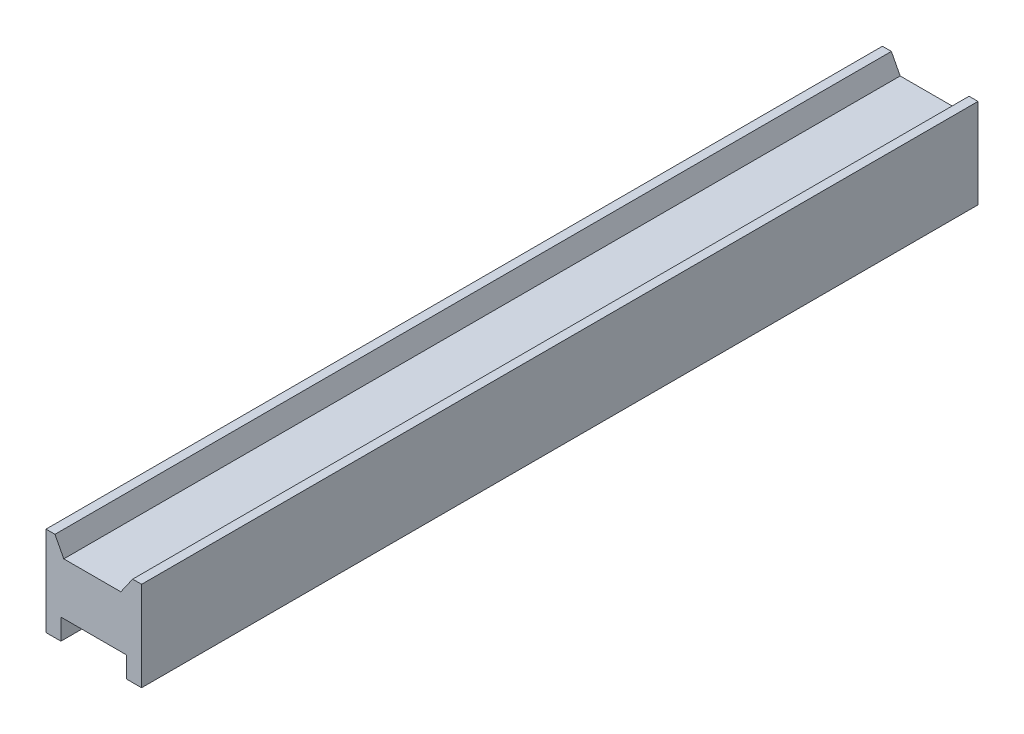
ISO-10303-21;
HEADER;
FILE_DESCRIPTION(('STEP AP214'),'2;1');
FILE_NAME('part.step','',(''),(''),'','','');
FILE_SCHEMA(('AUTOMOTIVE_DESIGN { 1 0 10303 214 1 1 1 1 }'));
ENDSEC;
DATA;
#1=APPLICATION_CONTEXT('core data for automotive mechanical design processes');
#2=APPLICATION_PROTOCOL_DEFINITION('international standard','automotive_design',2000,#1);
#3=PRODUCT_CONTEXT('',#1,'mechanical');
#4=PRODUCT('Part','Part','',(#3));
#5=PRODUCT_RELATED_PRODUCT_CATEGORY('part','',(#4));
#6=PRODUCT_DEFINITION_FORMATION('','',#4);
#7=PRODUCT_DEFINITION_CONTEXT('part definition',#1,'design');
#8=PRODUCT_DEFINITION('design','',#6,#7);
#9=PRODUCT_DEFINITION_SHAPE('','',#8);
#10=(LENGTH_UNIT() NAMED_UNIT(*) SI_UNIT(.MILLI.,.METRE.));
#11=(NAMED_UNIT(*) PLANE_ANGLE_UNIT() SI_UNIT($,.RADIAN.));
#12=(NAMED_UNIT(*) SI_UNIT($,.STERADIAN.) SOLID_ANGLE_UNIT());
#13=UNCERTAINTY_MEASURE_WITH_UNIT(LENGTH_MEASURE(1.E-05),#10,'distance_accuracy_value','');
#14=(GEOMETRIC_REPRESENTATION_CONTEXT(3) GLOBAL_UNCERTAINTY_ASSIGNED_CONTEXT((#13)) GLOBAL_UNIT_ASSIGNED_CONTEXT((#10,
#11,#12)) REPRESENTATION_CONTEXT('',''));
#15=CARTESIAN_POINT('',(0.,0.,0.));
#16=DIRECTION('',(0.,0.,1.));
#17=DIRECTION('',(1.,0.,0.));
#18=AXIS2_PLACEMENT_3D('',#15,#16,#17);
#19=CARTESIAN_POINT('',(0.,0.,14000.));
#20=DIRECTION('',(0.,1.,0.));
#21=DIRECTION('',(0.,0.,1.));
#22=AXIS2_PLACEMENT_3D('',#19,#20,#21);
#23=PLANE('',#22);
#24=DIRECTION('',(1.,0.,0.));
#25=VECTOR('',#24,1.);
#26=CARTESIAN_POINT('',(0.,0.,0.));
#27=LINE('',#26,#25);
#28=CARTESIAN_POINT('',(0.,0.,0.));
#29=VERTEX_POINT('',#28);
#30=CARTESIAN_POINT('',(250.,0.,0.));
#31=VERTEX_POINT('',#30);
#32=EDGE_CURVE('E155',#29,#31,#27,.T.);
#33=ORIENTED_EDGE('',*,*,#32,.T.);
#34=DIRECTION('',(0.,0.,-1.));
#35=VECTOR('',#34,1.);
#36=CARTESIAN_POINT('',(250.,0.,14000.));
#37=LINE('',#36,#35);
#38=CARTESIAN_POINT('',(250.,0.,14000.));
#39=VERTEX_POINT('',#38);
#40=EDGE_CURVE('E11',#39,#31,#37,.T.);
#41=ORIENTED_EDGE('',*,*,#40,.F.);
#42=DIRECTION('',(1.,0.,0.));
#43=VECTOR('',#42,1.);
#44=CARTESIAN_POINT('',(0.,0.,14000.));
#45=LINE('',#44,#43);
#46=CARTESIAN_POINT('',(0.,0.,14000.));
#47=VERTEX_POINT('',#46);
#48=EDGE_CURVE('E177',#47,#39,#45,.T.);
#49=ORIENTED_EDGE('',*,*,#48,.F.);
#50=DIRECTION('',(0.,0.,-1.));
#51=VECTOR('',#50,1.);
#52=CARTESIAN_POINT('',(0.,0.,14000.));
#53=LINE('',#52,#51);
#54=EDGE_CURVE('E151',#47,#29,#53,.T.);
#55=ORIENTED_EDGE('',*,*,#54,.T.);
#56=EDGE_LOOP('',(#33,#41,#49,#55));
#57=FACE_BOUND('',#56,.T.);
#58=ADVANCED_FACE('F35',(#57),#23,.F.);
#59=CARTESIAN_POINT('',(250.,0.,14000.));
#60=DIRECTION('',(-1.,0.,0.));
#61=DIRECTION('',(0.,0.,1.));
#62=AXIS2_PLACEMENT_3D('',#59,#60,#61);
#63=PLANE('',#62);
#64=DIRECTION('',(0.,1.,0.));
#65=VECTOR('',#64,1.);
#66=CARTESIAN_POINT('',(250.,0.,0.));
#67=LINE('',#66,#65);
#68=CARTESIAN_POINT('',(250.,350.,0.));
#69=VERTEX_POINT('',#68);
#70=EDGE_CURVE('E158',#31,#69,#67,.T.);
#71=ORIENTED_EDGE('',*,*,#70,.T.);
#72=DIRECTION('',(0.,0.,-1.));
#73=VECTOR('',#72,1.);
#74=CARTESIAN_POINT('',(250.,350.,14000.));
#75=LINE('',#74,#73);
#76=CARTESIAN_POINT('',(250.,350.,14000.));
#77=VERTEX_POINT('',#76);
#78=EDGE_CURVE('E43',#77,#69,#75,.T.);
#79=ORIENTED_EDGE('',*,*,#78,.F.);
#80=DIRECTION('',(0.,1.,0.));
#81=VECTOR('',#80,1.);
#82=CARTESIAN_POINT('',(250.,0.,14000.));
#83=LINE('',#82,#81);
#84=EDGE_CURVE('E106',#39,#77,#83,.T.);
#85=ORIENTED_EDGE('',*,*,#84,.F.);
#86=ORIENTED_EDGE('',*,*,#40,.T.);
#87=EDGE_LOOP('',(#71,#79,#85,#86));
#88=FACE_BOUND('',#87,.T.);
#89=ADVANCED_FACE('F255',(#88),#63,.F.);
#90=CARTESIAN_POINT('',(250.,350.,14000.));
#91=DIRECTION('',(0.,1.,0.));
#92=DIRECTION('',(0.,0.,1.));
#93=AXIS2_PLACEMENT_3D('',#90,#91,#92);
#94=PLANE('',#93);
#95=DIRECTION('',(1.,0.,0.));
#96=VECTOR('',#95,1.);
#97=CARTESIAN_POINT('',(250.,350.,0.));
#98=LINE('',#97,#96);
#99=CARTESIAN_POINT('',(1350.,350.,0.));
#100=VERTEX_POINT('',#99);
#101=EDGE_CURVE('E160',#69,#100,#98,.T.);
#102=ORIENTED_EDGE('',*,*,#101,.T.);
#103=DIRECTION('',(0.,0.,-1.));
#104=VECTOR('',#103,1.);
#105=CARTESIAN_POINT('',(1350.,350.,14000.));
#106=LINE('',#105,#104);
#107=CARTESIAN_POINT('',(1350.,350.,14000.));
#108=VERTEX_POINT('',#107);
#109=EDGE_CURVE('E196',#108,#100,#106,.T.);
#110=ORIENTED_EDGE('',*,*,#109,.F.);
#111=DIRECTION('',(1.,0.,0.));
#112=VECTOR('',#111,1.);
#113=CARTESIAN_POINT('',(250.,350.,14000.));
#114=LINE('',#113,#112);
#115=EDGE_CURVE('E204',#77,#108,#114,.T.);
#116=ORIENTED_EDGE('',*,*,#115,.F.);
#117=ORIENTED_EDGE('',*,*,#78,.T.);
#118=EDGE_LOOP('',(#102,#110,#116,#117));
#119=FACE_BOUND('',#118,.T.);
#120=ADVANCED_FACE('F202',(#119),#94,.F.);
#121=CARTESIAN_POINT('',(1350.,350.,14000.));
#122=DIRECTION('',(1.,0.,0.));
#123=DIRECTION('',(0.,0.,-1.));
#124=AXIS2_PLACEMENT_3D('',#121,#122,#123);
#125=PLANE('',#124);
#126=DIRECTION('',(0.,-1.,0.));
#127=VECTOR('',#126,1.);
#128=CARTESIAN_POINT('',(1350.,350.,0.));
#129=LINE('',#128,#127);
#130=CARTESIAN_POINT('',(1350.,0.,0.));
#131=VERTEX_POINT('',#130);
#132=EDGE_CURVE('E162',#100,#131,#129,.T.);
#133=ORIENTED_EDGE('',*,*,#132,.T.);
#134=DIRECTION('',(0.,0.,-1.));
#135=VECTOR('',#134,1.);
#136=CARTESIAN_POINT('',(1350.,0.,14000.));
#137=LINE('',#136,#135);
#138=CARTESIAN_POINT('',(1350.,0.,14000.));
#139=VERTEX_POINT('',#138);
#140=EDGE_CURVE('E193',#139,#131,#137,.T.);
#141=ORIENTED_EDGE('',*,*,#140,.F.);
#142=DIRECTION('',(0.,-1.,0.));
#143=VECTOR('',#142,1.);
#144=CARTESIAN_POINT('',(1350.,350.,14000.));
#145=LINE('',#144,#143);
#146=EDGE_CURVE('E222',#108,#139,#145,.T.);
#147=ORIENTED_EDGE('',*,*,#146,.F.);
#148=ORIENTED_EDGE('',*,*,#109,.T.);
#149=EDGE_LOOP('',(#133,#141,#147,#148));
#150=FACE_BOUND('',#149,.T.);
#151=ADVANCED_FACE('F213',(#150),#125,.F.);
#152=CARTESIAN_POINT('',(1350.,0.,14000.));
#153=DIRECTION('',(0.,1.,0.));
#154=DIRECTION('',(0.,0.,1.));
#155=AXIS2_PLACEMENT_3D('',#152,#153,#154);
#156=PLANE('',#155);
#157=DIRECTION('',(1.,0.,0.));
#158=VECTOR('',#157,1.);
#159=CARTESIAN_POINT('',(1350.,0.,0.));
#160=LINE('',#159,#158);
#161=CARTESIAN_POINT('',(1600.,0.,0.));
#162=VERTEX_POINT('',#161);
#163=EDGE_CURVE('E164',#131,#162,#160,.T.);
#164=ORIENTED_EDGE('',*,*,#163,.T.);
#165=DIRECTION('',(0.,0.,-1.));
#166=VECTOR('',#165,1.);
#167=CARTESIAN_POINT('',(1600.,0.,14000.));
#168=LINE('',#167,#166);
#169=CARTESIAN_POINT('',(1600.,0.,14000.));
#170=VERTEX_POINT('',#169);
#171=EDGE_CURVE('E190',#170,#162,#168,.T.);
#172=ORIENTED_EDGE('',*,*,#171,.F.);
#173=DIRECTION('',(1.,0.,0.));
#174=VECTOR('',#173,1.);
#175=CARTESIAN_POINT('',(1350.,0.,14000.));
#176=LINE('',#175,#174);
#177=EDGE_CURVE('E219',#139,#170,#176,.T.);
#178=ORIENTED_EDGE('',*,*,#177,.F.);
#179=ORIENTED_EDGE('',*,*,#140,.T.);
#180=EDGE_LOOP('',(#164,#172,#178,#179));
#181=FACE_BOUND('',#180,.T.);
#182=ADVANCED_FACE('F217',(#181),#156,.F.);
#183=CARTESIAN_POINT('',(1600.,0.,14000.));
#184=DIRECTION('',(-1.,0.,0.));
#185=DIRECTION('',(0.,0.,1.));
#186=AXIS2_PLACEMENT_3D('',#183,#184,#185);
#187=PLANE('',#186);
#188=DIRECTION('',(0.,1.,0.));
#189=VECTOR('',#188,1.);
#190=CARTESIAN_POINT('',(1600.,0.,0.));
#191=LINE('',#190,#189);
#192=CARTESIAN_POINT('',(1600.,1500.,0.));
#193=VERTEX_POINT('',#192);
#194=EDGE_CURVE('E166',#162,#193,#191,.T.);
#195=ORIENTED_EDGE('',*,*,#194,.T.);
#196=DIRECTION('',(0.,0.,-1.));
#197=VECTOR('',#196,1.);
#198=CARTESIAN_POINT('',(1600.,1500.,14000.));
#199=LINE('',#198,#197);
#200=CARTESIAN_POINT('',(1600.,1500.,14000.));
#201=VERTEX_POINT('',#200);
#202=EDGE_CURVE('E187',#201,#193,#199,.T.);
#203=ORIENTED_EDGE('',*,*,#202,.F.);
#204=DIRECTION('',(0.,1.,0.));
#205=VECTOR('',#204,1.);
#206=CARTESIAN_POINT('',(1600.,0.,14000.));
#207=LINE('',#206,#205);
#208=EDGE_CURVE('E221',#170,#201,#207,.T.);
#209=ORIENTED_EDGE('',*,*,#208,.F.);
#210=ORIENTED_EDGE('',*,*,#171,.T.);
#211=EDGE_LOOP('',(#195,#203,#209,#210));
#212=FACE_BOUND('',#211,.T.);
#213=ADVANCED_FACE('F268',(#212),#187,.F.);
#214=CARTESIAN_POINT('',(1600.,1500.,14000.));
#215=DIRECTION('',(0.,-1.,0.));
#216=DIRECTION('',(0.,0.,-1.));
#217=AXIS2_PLACEMENT_3D('',#214,#215,#216);
#218=PLANE('',#217);
#219=DIRECTION('',(-1.,0.,0.));
#220=VECTOR('',#219,1.);
#221=CARTESIAN_POINT('',(1600.,1500.,0.));
#222=LINE('',#221,#220);
#223=CARTESIAN_POINT('',(1450.,1500.,0.));
#224=VERTEX_POINT('',#223);
#225=EDGE_CURVE('E168',#193,#224,#222,.T.);
#226=ORIENTED_EDGE('',*,*,#225,.T.);
#227=DIRECTION('',(0.,0.,-1.));
#228=VECTOR('',#227,1.);
#229=CARTESIAN_POINT('',(1450.,1500.,14000.));
#230=LINE('',#229,#228);
#231=CARTESIAN_POINT('',(1450.,1500.,14000.));
#232=VERTEX_POINT('',#231);
#233=EDGE_CURVE('E184',#232,#224,#230,.T.);
#234=ORIENTED_EDGE('',*,*,#233,.F.);
#235=DIRECTION('',(-1.,0.,0.));
#236=VECTOR('',#235,1.);
#237=CARTESIAN_POINT('',(1600.,1500.,14000.));
#238=LINE('',#237,#236);
#239=EDGE_CURVE('E224',#201,#232,#238,.T.);
#240=ORIENTED_EDGE('',*,*,#239,.F.);
#241=ORIENTED_EDGE('',*,*,#202,.T.);
#242=EDGE_LOOP('',(#226,#234,#240,#241));
#243=FACE_BOUND('',#242,.T.);
#244=ADVANCED_FACE('F271',(#243),#218,.F.);
#245=CARTESIAN_POINT('',(1450.,1500.,14000.));
#246=DIRECTION('',(0.819152044288993,-0.573576436351045,0.));
#247=DIRECTION('',(0.573576436351045,0.819152044288993,0.));
#248=AXIS2_PLACEMENT_3D('',#245,#246,#247);
#249=PLANE('',#248);
#250=DIRECTION('',(-0.573576436351045,-0.819152044288993,0.));
#251=VECTOR('',#250,1.);
#252=CARTESIAN_POINT('',(1450.,1500.,0.));
#253=LINE('',#252,#251);
#254=CARTESIAN_POINT('',(1252.23084732619,1217.55637881382,0.));
#255=VERTEX_POINT('',#254);
#256=EDGE_CURVE('E170',#224,#255,#253,.T.);
#257=ORIENTED_EDGE('',*,*,#256,.T.);
#258=DIRECTION('',(0.,0.,-1.));
#259=VECTOR('',#258,1.);
#260=CARTESIAN_POINT('',(1252.23084732619,1217.55637881382,14000.));
#261=LINE('',#260,#259);
#262=CARTESIAN_POINT('',(1252.23084732619,1217.55637881382,14000.));
#263=VERTEX_POINT('',#262);
#264=EDGE_CURVE('E181',#263,#255,#261,.T.);
#265=ORIENTED_EDGE('',*,*,#264,.F.);
#266=DIRECTION('',(-0.573576436351045,-0.819152044288993,0.));
#267=VECTOR('',#266,1.);
#268=CARTESIAN_POINT('',(1450.,1500.,14000.));
#269=LINE('',#268,#267);
#270=EDGE_CURVE('E230',#232,#263,#269,.T.);
#271=ORIENTED_EDGE('',*,*,#270,.F.);
#272=ORIENTED_EDGE('',*,*,#233,.T.);
#273=EDGE_LOOP('',(#257,#265,#271,#272));
#274=FACE_BOUND('',#273,.T.);
#275=ADVANCED_FACE('F236',(#274),#249,.F.);
#276=CARTESIAN_POINT('',(1252.23084732619,1217.55637881382,14000.));
#277=DIRECTION('',(0.,-1.,0.));
#278=DIRECTION('',(0.,0.,-1.));
#279=AXIS2_PLACEMENT_3D('',#276,#277,#278);
#280=PLANE('',#279);
#281=DIRECTION('',(-1.,0.,0.));
#282=VECTOR('',#281,1.);
#283=CARTESIAN_POINT('',(1252.23084732619,1217.55637881382,0.));
#284=LINE('',#283,#282);
#285=CARTESIAN_POINT('',(297.692749099082,1217.55637881382,0.));
#286=VERTEX_POINT('',#285);
#287=EDGE_CURVE('E172',#255,#286,#284,.T.);
#288=ORIENTED_EDGE('',*,*,#287,.T.);
#289=DIRECTION('',(0.,0.,-1.));
#290=VECTOR('',#289,1.);
#291=CARTESIAN_POINT('',(297.692749099082,1217.55637881382,14000.));
#292=LINE('',#291,#290);
#293=CARTESIAN_POINT('',(297.692749099082,1217.55637881382,14000.));
#294=VERTEX_POINT('',#293);
#295=EDGE_CURVE('E146',#294,#286,#292,.T.);
#296=ORIENTED_EDGE('',*,*,#295,.F.);
#297=DIRECTION('',(-1.,0.,0.));
#298=VECTOR('',#297,1.);
#299=CARTESIAN_POINT('',(1252.23084732619,1217.55637881382,14000.));
#300=LINE('',#299,#298);
#301=EDGE_CURVE('E137',#263,#294,#300,.T.);
#302=ORIENTED_EDGE('',*,*,#301,.F.);
#303=ORIENTED_EDGE('',*,*,#264,.T.);
#304=EDGE_LOOP('',(#288,#296,#302,#303));
#305=FACE_BOUND('',#304,.T.);
#306=ADVANCED_FACE('F240',(#305),#280,.F.);
#307=CARTESIAN_POINT('',(297.692749099082,1217.55637881382,14000.));
#308=DIRECTION('',(-0.886158756858882,-0.463381762310862,0.));
#309=DIRECTION('',(0.463381762310862,-0.886158756858882,0.));
#310=AXIS2_PLACEMENT_3D('',#307,#308,#309);
#311=PLANE('',#310);
#312=DIRECTION('',(-0.463381762310862,0.886158756858882,0.));
#313=VECTOR('',#312,1.);
#314=CARTESIAN_POINT('',(297.692749099082,1217.55637881382,0.));
#315=LINE('',#314,#313);
#316=CARTESIAN_POINT('',(150.,1500.,0.));
#317=VERTEX_POINT('',#316);
#318=EDGE_CURVE('E145',#286,#317,#315,.T.);
#319=ORIENTED_EDGE('',*,*,#318,.T.);
#320=DIRECTION('',(0.,0.,-1.));
#321=VECTOR('',#320,1.);
#322=CARTESIAN_POINT('',(150.,1500.,14000.));
#323=LINE('',#322,#321);
#324=CARTESIAN_POINT('',(150.,1500.,14000.));
#325=VERTEX_POINT('',#324);
#326=EDGE_CURVE('E142',#325,#317,#323,.T.);
#327=ORIENTED_EDGE('',*,*,#326,.F.);
#328=DIRECTION('',(-0.463381762310862,0.886158756858882,0.));
#329=VECTOR('',#328,1.);
#330=CARTESIAN_POINT('',(297.692749099082,1217.55637881382,14000.));
#331=LINE('',#330,#329);
#332=EDGE_CURVE('E131',#294,#325,#331,.T.);
#333=ORIENTED_EDGE('',*,*,#332,.F.);
#334=ORIENTED_EDGE('',*,*,#295,.T.);
#335=EDGE_LOOP('',(#319,#327,#333,#334));
#336=FACE_BOUND('',#335,.T.);
#337=ADVANCED_FACE('F143',(#336),#311,.F.);
#338=CARTESIAN_POINT('',(150.,1500.,14000.));
#339=DIRECTION('',(0.,-1.,0.));
#340=DIRECTION('',(0.,0.,-1.));
#341=AXIS2_PLACEMENT_3D('',#338,#339,#340);
#342=PLANE('',#341);
#343=DIRECTION('',(-1.,0.,0.));
#344=VECTOR('',#343,1.);
#345=CARTESIAN_POINT('',(150.,1500.,0.));
#346=LINE('',#345,#344);
#347=CARTESIAN_POINT('',(0.,1500.,0.));
#348=VERTEX_POINT('',#347);
#349=EDGE_CURVE('E92',#317,#348,#346,.T.);
#350=ORIENTED_EDGE('',*,*,#349,.T.);
#351=DIRECTION('',(0.,0.,-1.));
#352=VECTOR('',#351,1.);
#353=CARTESIAN_POINT('',(0.,1500.,14000.));
#354=LINE('',#353,#352);
#355=CARTESIAN_POINT('',(0.,1500.,14000.));
#356=VERTEX_POINT('',#355);
#357=EDGE_CURVE('E147',#356,#348,#354,.T.);
#358=ORIENTED_EDGE('',*,*,#357,.F.);
#359=DIRECTION('',(-1.,0.,0.));
#360=VECTOR('',#359,1.);
#361=CARTESIAN_POINT('',(150.,1500.,14000.));
#362=LINE('',#361,#360);
#363=EDGE_CURVE('E135',#325,#356,#362,.T.);
#364=ORIENTED_EDGE('',*,*,#363,.F.);
#365=ORIENTED_EDGE('',*,*,#326,.T.);
#366=EDGE_LOOP('',(#350,#358,#364,#365));
#367=FACE_BOUND('',#366,.T.);
#368=ADVANCED_FACE('F149',(#367),#342,.F.);
#369=CARTESIAN_POINT('',(0.,0.,14000.));
#370=DIRECTION('',(1.,0.,0.));
#371=DIRECTION('',(0.,0.,-1.));
#372=AXIS2_PLACEMENT_3D('',#369,#370,#371);
#373=PLANE('',#372);
#374=DIRECTION('',(0.,-1.,0.));
#375=VECTOR('',#374,1.);
#376=CARTESIAN_POINT('',(0.,0.,0.));
#377=LINE('',#376,#375);
#378=EDGE_CURVE('E98',#348,#29,#377,.T.);
#379=ORIENTED_EDGE('',*,*,#378,.T.);
#380=ORIENTED_EDGE('',*,*,#54,.F.);
#381=DIRECTION('',(0.,-1.,0.));
#382=VECTOR('',#381,1.);
#383=CARTESIAN_POINT('',(0.,0.,14000.));
#384=LINE('',#383,#382);
#385=EDGE_CURVE('E51',#356,#47,#384,.T.);
#386=ORIENTED_EDGE('',*,*,#385,.F.);
#387=ORIENTED_EDGE('',*,*,#357,.T.);
#388=EDGE_LOOP('',(#379,#380,#386,#387));
#389=FACE_BOUND('',#388,.T.);
#390=ADVANCED_FACE('F244',(#389),#373,.F.);
#391=CARTESIAN_POINT('',(0.,0.,14000.));
#392=DIRECTION('',(0.,0.,1.));
#393=DIRECTION('',(1.,0.,0.));
#394=AXIS2_PLACEMENT_3D('',#391,#392,#393);
#395=PLANE('',#394);
#396=ORIENTED_EDGE('',*,*,#48,.T.);
#397=ORIENTED_EDGE('',*,*,#84,.T.);
#398=ORIENTED_EDGE('',*,*,#115,.T.);
#399=ORIENTED_EDGE('',*,*,#146,.T.);
#400=ORIENTED_EDGE('',*,*,#177,.T.);
#401=ORIENTED_EDGE('',*,*,#208,.T.);
#402=ORIENTED_EDGE('',*,*,#239,.T.);
#403=ORIENTED_EDGE('',*,*,#270,.T.);
#404=ORIENTED_EDGE('',*,*,#301,.T.);
#405=ORIENTED_EDGE('',*,*,#332,.T.);
#406=ORIENTED_EDGE('',*,*,#363,.T.);
#407=ORIENTED_EDGE('',*,*,#385,.T.);
#408=EDGE_LOOP('',(#396,#397,#398,#399,#400,#401,#402,#403,#404,#405,#406,#407));
#409=FACE_BOUND('',#408,.T.);
#410=ADVANCED_FACE('F133',(#409),#395,.T.);
#411=CARTESIAN_POINT('',(0.,0.,0.));
#412=DIRECTION('',(0.,0.,1.));
#413=DIRECTION('',(1.,0.,0.));
#414=AXIS2_PLACEMENT_3D('',#411,#412,#413);
#415=PLANE('',#414);
#416=ORIENTED_EDGE('',*,*,#32,.F.);
#417=ORIENTED_EDGE('',*,*,#378,.F.);
#418=ORIENTED_EDGE('',*,*,#349,.F.);
#419=ORIENTED_EDGE('',*,*,#318,.F.);
#420=ORIENTED_EDGE('',*,*,#287,.F.);
#421=ORIENTED_EDGE('',*,*,#256,.F.);
#422=ORIENTED_EDGE('',*,*,#225,.F.);
#423=ORIENTED_EDGE('',*,*,#194,.F.);
#424=ORIENTED_EDGE('',*,*,#163,.F.);
#425=ORIENTED_EDGE('',*,*,#132,.F.);
#426=ORIENTED_EDGE('',*,*,#101,.F.);
#427=ORIENTED_EDGE('',*,*,#70,.F.);
#428=EDGE_LOOP('',(#416,#417,#418,#419,#420,#421,#422,#423,#424,#425,#426,#427));
#429=FACE_BOUND('',#428,.T.);
#430=ADVANCED_FACE('F208',(#429),#415,.F.);
#431=CLOSED_SHELL('',(#58,#89,#120,#151,#182,#213,#244,#275,#306,#337,#368,#390,#410,#430));
#432=MANIFOLD_SOLID_BREP('B2',#431);
#433=ADVANCED_BREP_SHAPE_REPRESENTATION('',(#18,#432),#14);
#434=SHAPE_DEFINITION_REPRESENTATION(#9,#433);
ENDSEC;
END-ISO-10303-21;
